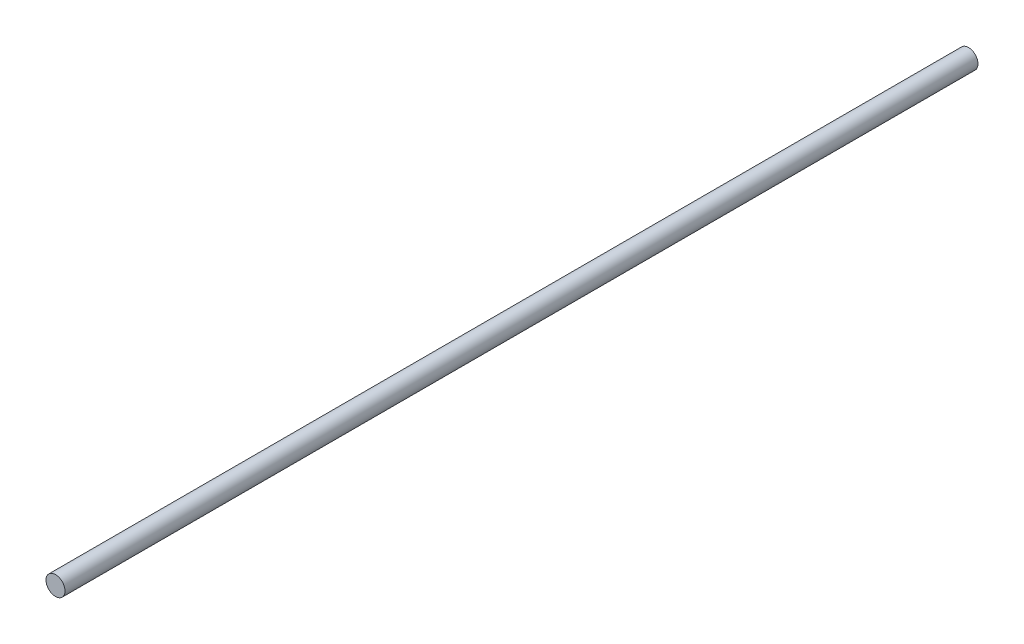
ISO-10303-21;
HEADER;
FILE_DESCRIPTION(('STEP AP214'),'2;1');
FILE_NAME('part.step','',(''),(''),'','','');
FILE_SCHEMA(('AUTOMOTIVE_DESIGN { 1 0 10303 214 1 1 1 1 }'));
ENDSEC;
DATA;
#1=APPLICATION_CONTEXT('core data for automotive mechanical design processes');
#2=APPLICATION_PROTOCOL_DEFINITION('international standard','automotive_design',2000,#1);
#3=PRODUCT_CONTEXT('',#1,'mechanical');
#4=PRODUCT('Part','Part','',(#3));
#5=PRODUCT_RELATED_PRODUCT_CATEGORY('part','',(#4));
#6=PRODUCT_DEFINITION_FORMATION('','',#4);
#7=PRODUCT_DEFINITION_CONTEXT('part definition',#1,'design');
#8=PRODUCT_DEFINITION('design','',#6,#7);
#9=PRODUCT_DEFINITION_SHAPE('','',#8);
#10=(LENGTH_UNIT() NAMED_UNIT(*) SI_UNIT(.MILLI.,.METRE.));
#11=(NAMED_UNIT(*) PLANE_ANGLE_UNIT() SI_UNIT($,.RADIAN.));
#12=(NAMED_UNIT(*) SI_UNIT($,.STERADIAN.) SOLID_ANGLE_UNIT());
#13=UNCERTAINTY_MEASURE_WITH_UNIT(LENGTH_MEASURE(1.E-05),#10,'distance_accuracy_value','');
#14=(GEOMETRIC_REPRESENTATION_CONTEXT(3) GLOBAL_UNCERTAINTY_ASSIGNED_CONTEXT((#13)) GLOBAL_UNIT_ASSIGNED_CONTEXT((#10,
#11,#12)) REPRESENTATION_CONTEXT('',''));
#15=CARTESIAN_POINT('',(0.,0.,0.));
#16=DIRECTION('',(0.,0.,1.));
#17=DIRECTION('',(1.,0.,0.));
#18=AXIS2_PLACEMENT_3D('',#15,#16,#17);
#19=CARTESIAN_POINT('',(0.,0.,152.4));
#20=DIRECTION('',(0.,0.,-1.));
#21=DIRECTION('',(-1.,0.,0.));
#22=AXIS2_PLACEMENT_3D('',#19,#20,#21);
#23=CYLINDRICAL_SURFACE('',#22,3.175);
#24=CARTESIAN_POINT('',(0.,0.,152.4));
#25=DIRECTION('',(0.,0.,1.));
#26=DIRECTION('',(1.,0.,0.));
#27=AXIS2_PLACEMENT_3D('',#24,#25,#26);
#28=CIRCLE('',#27,3.175);
#29=CARTESIAN_POINT('',(3.175,0.,152.4));
#30=VERTEX_POINT('',#29);
#31=EDGE_CURVE('E10',#30,#30,#28,.T.);
#32=ORIENTED_EDGE('',*,*,#31,.F.);
#33=EDGE_LOOP('',(#32));
#34=FACE_BOUND('',#33,.T.);
#35=CARTESIAN_POINT('',(0.,0.,-152.4));
#36=DIRECTION('',(0.,0.,1.));
#37=DIRECTION('',(1.,0.,0.));
#38=AXIS2_PLACEMENT_3D('',#35,#36,#37);
#39=CIRCLE('',#38,3.175);
#40=CARTESIAN_POINT('',(3.175,0.,-152.4));
#41=VERTEX_POINT('',#40);
#42=EDGE_CURVE('E38',#41,#41,#39,.T.);
#43=ORIENTED_EDGE('',*,*,#42,.T.);
#44=EDGE_LOOP('',(#43));
#45=FACE_BOUND('',#44,.T.);
#46=ADVANCED_FACE('F32',(#34,#45),#23,.T.);
#47=CARTESIAN_POINT('',(0.,0.,152.4));
#48=DIRECTION('',(0.,0.,1.));
#49=DIRECTION('',(1.,0.,0.));
#50=AXIS2_PLACEMENT_3D('',#47,#48,#49);
#51=PLANE('',#50);
#52=ORIENTED_EDGE('',*,*,#31,.T.);
#53=EDGE_LOOP('',(#52));
#54=FACE_BOUND('',#53,.T.);
#55=ADVANCED_FACE('F47',(#54),#51,.T.);
#56=CARTESIAN_POINT('',(0.,0.,-152.4));
#57=DIRECTION('',(0.,0.,1.));
#58=DIRECTION('',(1.,0.,0.));
#59=AXIS2_PLACEMENT_3D('',#56,#57,#58);
#60=PLANE('',#59);
#61=ORIENTED_EDGE('',*,*,#42,.F.);
#62=EDGE_LOOP('',(#61));
#63=FACE_BOUND('',#62,.T.);
#64=ADVANCED_FACE('F45',(#63),#60,.F.);
#65=CLOSED_SHELL('',(#46,#55,#64));
#66=MANIFOLD_SOLID_BREP('B2',#65);
#67=ADVANCED_BREP_SHAPE_REPRESENTATION('',(#18,#66),#14);
#68=SHAPE_DEFINITION_REPRESENTATION(#9,#67);
ENDSEC;
END-ISO-10303-21;
